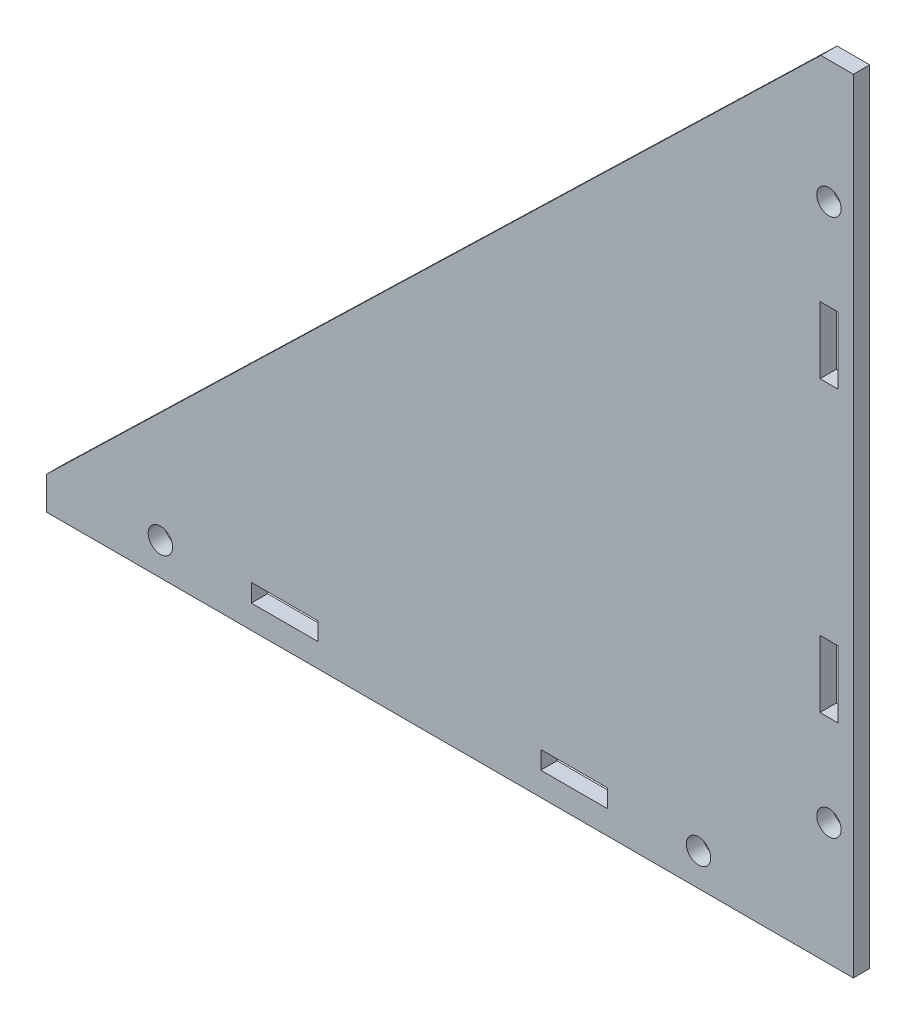
ISO-10303-21;
HEADER;
FILE_DESCRIPTION(('STEP AP214'),'2;1');
FILE_NAME('part.step','',(''),(''),'','','');
FILE_SCHEMA(('AUTOMOTIVE_DESIGN { 1 0 10303 214 1 1 1 1 }'));
ENDSEC;
DATA;
#1=APPLICATION_CONTEXT('core data for automotive mechanical design processes');
#2=APPLICATION_PROTOCOL_DEFINITION('international standard','automotive_design',2000,#1);
#3=PRODUCT_CONTEXT('',#1,'mechanical');
#4=PRODUCT('Part','Part','',(#3));
#5=PRODUCT_RELATED_PRODUCT_CATEGORY('part','',(#4));
#6=PRODUCT_DEFINITION_FORMATION('','',#4);
#7=PRODUCT_DEFINITION_CONTEXT('part definition',#1,'design');
#8=PRODUCT_DEFINITION('design','',#6,#7);
#9=PRODUCT_DEFINITION_SHAPE('','',#8);
#10=(LENGTH_UNIT() NAMED_UNIT(*) SI_UNIT(.MILLI.,.METRE.));
#11=(NAMED_UNIT(*) PLANE_ANGLE_UNIT() SI_UNIT($,.RADIAN.));
#12=(NAMED_UNIT(*) SI_UNIT($,.STERADIAN.) SOLID_ANGLE_UNIT());
#13=UNCERTAINTY_MEASURE_WITH_UNIT(LENGTH_MEASURE(1.E-05),#10,'distance_accuracy_value','');
#14=(GEOMETRIC_REPRESENTATION_CONTEXT(3) GLOBAL_UNCERTAINTY_ASSIGNED_CONTEXT((#13)) GLOBAL_UNIT_ASSIGNED_CONTEXT((#10,
#11,#12)) REPRESENTATION_CONTEXT('',''));
#15=CARTESIAN_POINT('',(0.,0.,0.));
#16=DIRECTION('',(0.,0.,1.));
#17=DIRECTION('',(1.,0.,0.));
#18=AXIS2_PLACEMENT_3D('',#15,#16,#17);
#19=CARTESIAN_POINT('',(0.,0.,2.));
#20=DIRECTION('',(0.,0.,1.));
#21=DIRECTION('',(1.,0.,0.));
#22=AXIS2_PLACEMENT_3D('',#19,#20,#21);
#23=PLANE('',#22);
#24=DIRECTION('',(0.,1.,0.));
#25=VECTOR('',#24,1.);
#26=CARTESIAN_POINT('',(47.8338443865942,-92.4245123954285,2.));
#27=LINE('',#26,#25);
#28=CARTESIAN_POINT('',(47.8338443865942,-92.4245123954285,2.));
#29=VERTEX_POINT('',#28);
#30=CARTESIAN_POINT('',(47.8338443865942,-84.2245123954286,2.));
#31=VERTEX_POINT('',#30);
#32=EDGE_CURVE('E220',#29,#31,#27,.T.);
#33=ORIENTED_EDGE('',*,*,#32,.F.);
#34=DIRECTION('',(1.,0.,0.));
#35=VECTOR('',#34,1.);
#36=CARTESIAN_POINT('',(45.6338443865943,-92.4245123954285,2.));
#37=LINE('',#36,#35);
#38=CARTESIAN_POINT('',(45.6338443865943,-92.4245123954285,2.));
#39=VERTEX_POINT('',#38);
#40=EDGE_CURVE('E218',#39,#29,#37,.T.);
#41=ORIENTED_EDGE('',*,*,#40,.F.);
#42=DIRECTION('',(0.,-1.,0.));
#43=VECTOR('',#42,1.);
#44=CARTESIAN_POINT('',(45.6338443865943,-92.4245123954285,2.));
#45=LINE('',#44,#43);
#46=CARTESIAN_POINT('',(45.6338443865943,-84.2245123954285,2.));
#47=VERTEX_POINT('',#46);
#48=EDGE_CURVE('E226',#47,#39,#45,.T.);
#49=ORIENTED_EDGE('',*,*,#48,.F.);
#50=DIRECTION('',(-1.,0.,0.));
#51=VECTOR('',#50,1.);
#52=CARTESIAN_POINT('',(45.6338443865943,-84.2245123954285,2.));
#53=LINE('',#52,#51);
#54=EDGE_CURVE('E223',#31,#47,#53,.T.);
#55=ORIENTED_EDGE('',*,*,#54,.F.);
#56=EDGE_LOOP('',(#33,#41,#49,#55));
#57=FACE_BOUND('',#56,.T.);
#58=DIRECTION('',(0.,-1.,0.));
#59=VECTOR('',#58,1.);
#60=CARTESIAN_POINT('',(11.3838443863399,-113.474512395683,2.));
#61=LINE('',#60,#59);
#62=CARTESIAN_POINT('',(11.3838443863399,-113.474512395683,2.));
#63=VERTEX_POINT('',#62);
#64=CARTESIAN_POINT('',(11.3838443863399,-115.674512395683,2.));
#65=VERTEX_POINT('',#64);
#66=EDGE_CURVE('E251',#63,#65,#61,.T.);
#67=ORIENTED_EDGE('',*,*,#66,.F.);
#68=DIRECTION('',(-1.,0.,0.));
#69=VECTOR('',#68,1.);
#70=CARTESIAN_POINT('',(19.5838443863399,-113.474512395683,2.));
#71=LINE('',#70,#69);
#72=CARTESIAN_POINT('',(19.5838443863399,-113.474512395683,2.));
#73=VERTEX_POINT('',#72);
#74=EDGE_CURVE('E249',#73,#63,#71,.T.);
#75=ORIENTED_EDGE('',*,*,#74,.F.);
#76=DIRECTION('',(0.,1.,0.));
#77=VECTOR('',#76,1.);
#78=CARTESIAN_POINT('',(19.5838443863399,-113.474512395683,2.));
#79=LINE('',#78,#77);
#80=CARTESIAN_POINT('',(19.5838443863399,-115.674512395683,2.));
#81=VERTEX_POINT('',#80);
#82=EDGE_CURVE('E257',#81,#73,#79,.T.);
#83=ORIENTED_EDGE('',*,*,#82,.F.);
#84=DIRECTION('',(1.,0.,0.));
#85=VECTOR('',#84,1.);
#86=CARTESIAN_POINT('',(19.5838443863399,-115.674512395683,2.));
#87=LINE('',#86,#85);
#88=EDGE_CURVE('E254',#65,#81,#87,.T.);
#89=ORIENTED_EDGE('',*,*,#88,.F.);
#90=EDGE_LOOP('',(#67,#75,#83,#89));
#91=FACE_BOUND('',#90,.T.);
#92=CARTESIAN_POINT('',(30.7338443863387,-114.574512395683,2.));
#93=DIRECTION('',(0.,0.,1.));
#94=DIRECTION('',(-1.,0.,0.));
#95=AXIS2_PLACEMENT_3D('',#92,#93,#94);
#96=CIRCLE('',#95,1.50000000007195);
#97=CARTESIAN_POINT('',(29.2338443862667,-114.574512395683,2.));
#98=VERTEX_POINT('',#97);
#99=EDGE_CURVE('E280',#98,#98,#96,.T.);
#100=ORIENTED_EDGE('',*,*,#99,.F.);
#101=EDGE_LOOP('',(#100));
#102=FACE_BOUND('',#101,.T.);
#103=DIRECTION('',(1.,0.,0.));
#104=VECTOR('',#103,1.);
#105=CARTESIAN_POINT('',(-24.116155613657,-115.674512395683,2.));
#106=LINE('',#105,#104);
#107=CARTESIAN_POINT('',(-24.116155613657,-115.674512395683,2.));
#108=VERTEX_POINT('',#107);
#109=CARTESIAN_POINT('',(-15.916155613657,-115.674512395683,2.));
#110=VERTEX_POINT('',#109);
#111=EDGE_CURVE('E294',#108,#110,#106,.T.);
#112=ORIENTED_EDGE('',*,*,#111,.F.);
#113=DIRECTION('',(0.,-1.,0.));
#114=VECTOR('',#113,1.);
#115=CARTESIAN_POINT('',(-24.116155613657,-113.474512395683,2.));
#116=LINE('',#115,#114);
#117=CARTESIAN_POINT('',(-24.116155613657,-113.474512395683,2.));
#118=VERTEX_POINT('',#117);
#119=EDGE_CURVE('E292',#118,#108,#116,.T.);
#120=ORIENTED_EDGE('',*,*,#119,.F.);
#121=DIRECTION('',(-1.,0.,0.));
#122=VECTOR('',#121,1.);
#123=CARTESIAN_POINT('',(-24.116155613657,-113.474512395683,2.));
#124=LINE('',#123,#122);
#125=CARTESIAN_POINT('',(-15.916155613657,-113.474512395683,2.));
#126=VERTEX_POINT('',#125);
#127=EDGE_CURVE('E300',#126,#118,#124,.T.);
#128=ORIENTED_EDGE('',*,*,#127,.F.);
#129=DIRECTION('',(0.,1.,0.));
#130=VECTOR('',#129,1.);
#131=CARTESIAN_POINT('',(-15.916155613657,-113.474512395683,2.));
#132=LINE('',#131,#130);
#133=EDGE_CURVE('E297',#110,#126,#132,.T.);
#134=ORIENTED_EDGE('',*,*,#133,.F.);
#135=EDGE_LOOP('',(#112,#120,#128,#134));
#136=FACE_BOUND('',#135,.T.);
#137=CARTESIAN_POINT('',(-35.2661556136557,-114.574512395683,2.));
#138=DIRECTION('',(0.,0.,1.));
#139=DIRECTION('',(1.,0.,0.));
#140=AXIS2_PLACEMENT_3D('',#137,#138,#139);
#141=CIRCLE('',#140,1.50000000007195);
#142=CARTESIAN_POINT('',(-33.7661556135838,-114.574512395683,2.));
#143=VERTEX_POINT('',#142);
#144=EDGE_CURVE('E323',#143,#143,#141,.T.);
#145=ORIENTED_EDGE('',*,*,#144,.F.);
#146=EDGE_LOOP('',(#145));
#147=FACE_BOUND('',#146,.T.);
#148=DIRECTION('',(1.,0.,0.));
#149=VECTOR('',#148,1.);
#150=CARTESIAN_POINT('',(48.7338443863415,-118.57451239543,2.));
#151=LINE('',#150,#149);
#152=CARTESIAN_POINT('',(-49.2661556136585,-118.57451239543,2.));
#153=VERTEX_POINT('',#152);
#154=CARTESIAN_POINT('',(49.7338443863415,-118.57451239543,2.));
#155=VERTEX_POINT('',#154);
#156=EDGE_CURVE('E329',#153,#155,#151,.T.);
#157=ORIENTED_EDGE('',*,*,#156,.T.);
#158=DIRECTION('',(0.,1.,0.));
#159=VECTOR('',#158,1.);
#160=CARTESIAN_POINT('',(49.7338443863415,-118.57451239543,2.));
#161=LINE('',#160,#159);
#162=CARTESIAN_POINT('',(49.7338443863415,-22.5745123954302,2.));
#163=VERTEX_POINT('',#162);
#164=EDGE_CURVE('E332',#155,#163,#161,.T.);
#165=ORIENTED_EDGE('',*,*,#164,.T.);
#166=DIRECTION('',(-1.,0.,0.));
#167=VECTOR('',#166,1.);
#168=CARTESIAN_POINT('',(49.7338443863415,-22.5745123954302,2.));
#169=LINE('',#168,#167);
#170=CARTESIAN_POINT('',(45.7338443863415,-22.5745123954302,2.));
#171=VERTEX_POINT('',#170);
#172=EDGE_CURVE('E335',#163,#171,#169,.T.);
#173=ORIENTED_EDGE('',*,*,#172,.T.);
#174=DIRECTION('',(-0.718358303958508,-0.695673304888046,0.));
#175=VECTOR('',#174,1.);
#176=CARTESIAN_POINT('',(45.7338443863415,-22.5745123954302,2.));
#177=LINE('',#176,#175);
#178=CARTESIAN_POINT('',(-49.2661556136585,-114.574512395683,2.));
#179=VERTEX_POINT('',#178);
#180=EDGE_CURVE('E337',#171,#179,#177,.T.);
#181=ORIENTED_EDGE('',*,*,#180,.T.);
#182=DIRECTION('',(0.,-1.,0.));
#183=VECTOR('',#182,1.);
#184=CARTESIAN_POINT('',(-49.2661556136585,-114.574512395683,2.));
#185=LINE('',#184,#183);
#186=EDGE_CURVE('E339',#179,#153,#185,.T.);
#187=ORIENTED_EDGE('',*,*,#186,.T.);
#188=EDGE_LOOP('',(#157,#165,#173,#181,#187));
#189=FACE_BOUND('',#188,.T.);
#190=CARTESIAN_POINT('',(46.7338443865942,-103.574512395427,2.));
#191=DIRECTION('',(0.,0.,1.));
#192=DIRECTION('',(1.,0.,0.));
#193=AXIS2_PLACEMENT_3D('',#190,#191,#192);
#194=CIRCLE('',#193,1.50000000007195);
#195=CARTESIAN_POINT('',(48.2338443866662,-103.574512395427,2.));
#196=VERTEX_POINT('',#195);
#197=EDGE_CURVE('E286',#196,#196,#194,.T.);
#198=ORIENTED_EDGE('',*,*,#197,.F.);
#199=EDGE_LOOP('',(#198));
#200=FACE_BOUND('',#199,.T.);
#201=CARTESIAN_POINT('',(46.7338443865921,-37.6161790621103,2.));
#202=DIRECTION('',(0.,0.,1.));
#203=DIRECTION('',(-1.,0.,0.));
#204=AXIS2_PLACEMENT_3D('',#201,#202,#203);
#205=CIRCLE('',#204,1.50000000007398);
#206=CARTESIAN_POINT('',(45.2338443865181,-37.6161790621103,2.));
#207=VERTEX_POINT('',#206);
#208=EDGE_CURVE('E212',#207,#207,#205,.T.);
#209=ORIENTED_EDGE('',*,*,#208,.F.);
#210=EDGE_LOOP('',(#209));
#211=FACE_BOUND('',#210,.T.);
#212=DIRECTION('',(1.,0.,0.));
#213=VECTOR('',#212,1.);
#214=CARTESIAN_POINT('',(45.6338443865923,-56.9661790621091,2.));
#215=LINE('',#214,#213);
#216=CARTESIAN_POINT('',(45.6338443865923,-56.9661790621091,2.));
#217=VERTEX_POINT('',#216);
#218=CARTESIAN_POINT('',(47.8338443865924,-56.966179062109,2.));
#219=VERTEX_POINT('',#218);
#220=EDGE_CURVE('E184',#217,#219,#215,.T.);
#221=ORIENTED_EDGE('',*,*,#220,.F.);
#222=DIRECTION('',(0.,-1.,0.));
#223=VECTOR('',#222,1.);
#224=CARTESIAN_POINT('',(45.6338443865918,-48.7661790621092,2.));
#225=LINE('',#224,#223);
#226=CARTESIAN_POINT('',(45.6338443865918,-48.7661790621092,2.));
#227=VERTEX_POINT('',#226);
#228=EDGE_CURVE('E176',#227,#217,#225,.T.);
#229=ORIENTED_EDGE('',*,*,#228,.F.);
#230=DIRECTION('',(-1.,0.,0.));
#231=VECTOR('',#230,1.);
#232=CARTESIAN_POINT('',(45.6338443865918,-48.7661790621092,2.));
#233=LINE('',#232,#231);
#234=CARTESIAN_POINT('',(47.8338443865924,-48.766179062109,2.));
#235=VERTEX_POINT('',#234);
#236=EDGE_CURVE('E198',#235,#227,#233,.T.);
#237=ORIENTED_EDGE('',*,*,#236,.F.);
#238=DIRECTION('',(0.,1.,0.));
#239=VECTOR('',#238,1.);
#240=CARTESIAN_POINT('',(47.8338443865924,-48.766179062109,2.));
#241=LINE('',#240,#239);
#242=EDGE_CURVE('E196',#219,#235,#241,.T.);
#243=ORIENTED_EDGE('',*,*,#242,.F.);
#244=EDGE_LOOP('',(#221,#229,#237,#243));
#245=FACE_BOUND('',#244,.T.);
#246=ADVANCED_FACE('F33',(#57,#91,#102,#136,#147,#189,#200,#211,#245),#23,.T.);
#247=CARTESIAN_POINT('',(0.,0.,0.));
#248=DIRECTION('',(0.,0.,1.));
#249=DIRECTION('',(1.,0.,0.));
#250=AXIS2_PLACEMENT_3D('',#247,#248,#249);
#251=PLANE('',#250);
#252=CARTESIAN_POINT('',(46.7338443865921,-37.6161790621103,0.));
#253=DIRECTION('',(0.,0.,1.));
#254=DIRECTION('',(-1.,0.,0.));
#255=AXIS2_PLACEMENT_3D('',#252,#253,#254);
#256=CIRCLE('',#255,1.50000000007398);
#257=CARTESIAN_POINT('',(45.2338443865181,-37.6161790621103,0.));
#258=VERTEX_POINT('',#257);
#259=EDGE_CURVE('E192',#258,#258,#256,.T.);
#260=ORIENTED_EDGE('',*,*,#259,.T.);
#261=EDGE_LOOP('',(#260));
#262=FACE_BOUND('',#261,.T.);
#263=DIRECTION('',(1.,0.,0.));
#264=VECTOR('',#263,1.);
#265=CARTESIAN_POINT('',(45.6338443865943,-92.4245123954285,0.));
#266=LINE('',#265,#264);
#267=CARTESIAN_POINT('',(45.6338443865943,-92.4245123954285,0.));
#268=VERTEX_POINT('',#267);
#269=CARTESIAN_POINT('',(47.8338443865942,-92.4245123954285,0.));
#270=VERTEX_POINT('',#269);
#271=EDGE_CURVE('E215',#268,#270,#266,.T.);
#272=ORIENTED_EDGE('',*,*,#271,.T.);
#273=DIRECTION('',(0.,1.,0.));
#274=VECTOR('',#273,1.);
#275=CARTESIAN_POINT('',(47.8338443865942,-92.4245123954285,0.));
#276=LINE('',#275,#274);
#277=CARTESIAN_POINT('',(47.8338443865942,-84.2245123954286,0.));
#278=VERTEX_POINT('',#277);
#279=EDGE_CURVE('E231',#270,#278,#276,.T.);
#280=ORIENTED_EDGE('',*,*,#279,.T.);
#281=DIRECTION('',(-1.,0.,0.));
#282=VECTOR('',#281,1.);
#283=CARTESIAN_POINT('',(45.6338443865943,-84.2245123954285,0.));
#284=LINE('',#283,#282);
#285=CARTESIAN_POINT('',(45.6338443865943,-84.2245123954285,0.));
#286=VERTEX_POINT('',#285);
#287=EDGE_CURVE('E234',#278,#286,#284,.T.);
#288=ORIENTED_EDGE('',*,*,#287,.T.);
#289=DIRECTION('',(0.,-1.,0.));
#290=VECTOR('',#289,1.);
#291=CARTESIAN_POINT('',(45.6338443865943,-92.4245123954285,0.));
#292=LINE('',#291,#290);
#293=EDGE_CURVE('E221',#286,#268,#292,.T.);
#294=ORIENTED_EDGE('',*,*,#293,.T.);
#295=EDGE_LOOP('',(#272,#280,#288,#294));
#296=FACE_BOUND('',#295,.T.);
#297=CARTESIAN_POINT('',(30.7338443863387,-114.574512395683,0.));
#298=DIRECTION('',(0.,0.,1.));
#299=DIRECTION('',(-1.,0.,0.));
#300=AXIS2_PLACEMENT_3D('',#297,#298,#299);
#301=CIRCLE('',#300,1.50000000007195);
#302=CARTESIAN_POINT('',(29.2338443862667,-114.574512395683,0.));
#303=VERTEX_POINT('',#302);
#304=EDGE_CURVE('E279',#303,#303,#301,.T.);
#305=ORIENTED_EDGE('',*,*,#304,.T.);
#306=EDGE_LOOP('',(#305));
#307=FACE_BOUND('',#306,.T.);
#308=CARTESIAN_POINT('',(46.7338443865942,-103.574512395427,0.));
#309=DIRECTION('',(0.,0.,1.));
#310=DIRECTION('',(1.,0.,0.));
#311=AXIS2_PLACEMENT_3D('',#308,#309,#310);
#312=CIRCLE('',#311,1.50000000007195);
#313=CARTESIAN_POINT('',(48.2338443866662,-103.574512395427,0.));
#314=VERTEX_POINT('',#313);
#315=EDGE_CURVE('E283',#314,#314,#312,.T.);
#316=ORIENTED_EDGE('',*,*,#315,.T.);
#317=EDGE_LOOP('',(#316));
#318=FACE_BOUND('',#317,.T.);
#319=DIRECTION('',(0.,-1.,0.));
#320=VECTOR('',#319,1.);
#321=CARTESIAN_POINT('',(-24.116155613657,-113.474512395683,0.));
#322=LINE('',#321,#320);
#323=CARTESIAN_POINT('',(-24.116155613657,-113.474512395683,0.));
#324=VERTEX_POINT('',#323);
#325=CARTESIAN_POINT('',(-24.116155613657,-115.674512395683,0.));
#326=VERTEX_POINT('',#325);
#327=EDGE_CURVE('E289',#324,#326,#322,.T.);
#328=ORIENTED_EDGE('',*,*,#327,.T.);
#329=DIRECTION('',(1.,0.,0.));
#330=VECTOR('',#329,1.);
#331=CARTESIAN_POINT('',(-24.116155613657,-115.674512395683,0.));
#332=LINE('',#331,#330);
#333=CARTESIAN_POINT('',(-15.916155613657,-115.674512395683,0.));
#334=VERTEX_POINT('',#333);
#335=EDGE_CURVE('E305',#326,#334,#332,.T.);
#336=ORIENTED_EDGE('',*,*,#335,.T.);
#337=DIRECTION('',(0.,1.,0.));
#338=VECTOR('',#337,1.);
#339=CARTESIAN_POINT('',(-15.916155613657,-113.474512395683,0.));
#340=LINE('',#339,#338);
#341=CARTESIAN_POINT('',(-15.916155613657,-113.474512395683,0.));
#342=VERTEX_POINT('',#341);
#343=EDGE_CURVE('E308',#334,#342,#340,.T.);
#344=ORIENTED_EDGE('',*,*,#343,.T.);
#345=DIRECTION('',(-1.,0.,0.));
#346=VECTOR('',#345,1.);
#347=CARTESIAN_POINT('',(-24.116155613657,-113.474512395683,0.));
#348=LINE('',#347,#346);
#349=EDGE_CURVE('E295',#342,#324,#348,.T.);
#350=ORIENTED_EDGE('',*,*,#349,.T.);
#351=EDGE_LOOP('',(#328,#336,#344,#350));
#352=FACE_BOUND('',#351,.T.);
#353=DIRECTION('',(0.,1.,0.));
#354=VECTOR('',#353,1.);
#355=CARTESIAN_POINT('',(49.7338443863415,-118.57451239543,0.));
#356=LINE('',#355,#354);
#357=CARTESIAN_POINT('',(49.7338443863415,-118.57451239543,0.));
#358=VERTEX_POINT('',#357);
#359=CARTESIAN_POINT('',(49.7338443863415,-22.5745123954302,0.));
#360=VERTEX_POINT('',#359);
#361=EDGE_CURVE('E326',#358,#360,#356,.T.);
#362=ORIENTED_EDGE('',*,*,#361,.F.);
#363=DIRECTION('',(1.,0.,0.));
#364=VECTOR('',#363,1.);
#365=CARTESIAN_POINT('',(44.7338443863415,-118.57451239543,0.));
#366=LINE('',#365,#364);
#367=CARTESIAN_POINT('',(-49.2661556136585,-118.57451239543,0.));
#368=VERTEX_POINT('',#367);
#369=EDGE_CURVE('E333',#368,#358,#366,.T.);
#370=ORIENTED_EDGE('',*,*,#369,.F.);
#371=DIRECTION('',(0.,-1.,0.));
#372=VECTOR('',#371,1.);
#373=CARTESIAN_POINT('',(-49.2661556136585,-114.574512395683,0.));
#374=LINE('',#373,#372);
#375=CARTESIAN_POINT('',(-49.2661556136585,-114.574512395683,0.));
#376=VERTEX_POINT('',#375);
#377=EDGE_CURVE('E348',#376,#368,#374,.T.);
#378=ORIENTED_EDGE('',*,*,#377,.F.);
#379=DIRECTION('',(-0.718358303958508,-0.695673304888046,0.));
#380=VECTOR('',#379,1.);
#381=CARTESIAN_POINT('',(45.7338443863415,-22.5745123954302,0.));
#382=LINE('',#381,#380);
#383=CARTESIAN_POINT('',(45.7338443863415,-22.5745123954302,0.));
#384=VERTEX_POINT('',#383);
#385=EDGE_CURVE('E346',#384,#376,#382,.T.);
#386=ORIENTED_EDGE('',*,*,#385,.F.);
#387=DIRECTION('',(-1.,0.,0.));
#388=VECTOR('',#387,1.);
#389=CARTESIAN_POINT('',(49.7338443863415,-22.5745123954302,0.));
#390=LINE('',#389,#388);
#391=EDGE_CURVE('E344',#360,#384,#390,.T.);
#392=ORIENTED_EDGE('',*,*,#391,.F.);
#393=EDGE_LOOP('',(#362,#370,#378,#386,#392));
#394=FACE_BOUND('',#393,.T.);
#395=CARTESIAN_POINT('',(-35.2661556136557,-114.574512395683,0.));
#396=DIRECTION('',(0.,0.,1.));
#397=DIRECTION('',(1.,0.,0.));
#398=AXIS2_PLACEMENT_3D('',#395,#396,#397);
#399=CIRCLE('',#398,1.50000000007195);
#400=CARTESIAN_POINT('',(-33.7661556135838,-114.574512395683,0.));
#401=VERTEX_POINT('',#400);
#402=EDGE_CURVE('E322',#401,#401,#399,.T.);
#403=ORIENTED_EDGE('',*,*,#402,.T.);
#404=EDGE_LOOP('',(#403));
#405=FACE_BOUND('',#404,.T.);
#406=DIRECTION('',(-1.,0.,0.));
#407=VECTOR('',#406,1.);
#408=CARTESIAN_POINT('',(19.5838443863399,-113.474512395683,0.));
#409=LINE('',#408,#407);
#410=CARTESIAN_POINT('',(19.5838443863399,-113.474512395683,0.));
#411=VERTEX_POINT('',#410);
#412=CARTESIAN_POINT('',(11.3838443863399,-113.474512395683,0.));
#413=VERTEX_POINT('',#412);
#414=EDGE_CURVE('E248',#411,#413,#409,.T.);
#415=ORIENTED_EDGE('',*,*,#414,.T.);
#416=DIRECTION('',(0.,-1.,0.));
#417=VECTOR('',#416,1.);
#418=CARTESIAN_POINT('',(11.3838443863399,-113.474512395683,0.));
#419=LINE('',#418,#417);
#420=CARTESIAN_POINT('',(11.3838443863399,-115.674512395683,0.));
#421=VERTEX_POINT('',#420);
#422=EDGE_CURVE('E262',#413,#421,#419,.T.);
#423=ORIENTED_EDGE('',*,*,#422,.T.);
#424=DIRECTION('',(1.,0.,0.));
#425=VECTOR('',#424,1.);
#426=CARTESIAN_POINT('',(19.5838443863399,-115.674512395683,0.));
#427=LINE('',#426,#425);
#428=CARTESIAN_POINT('',(19.5838443863399,-115.674512395683,0.));
#429=VERTEX_POINT('',#428);
#430=EDGE_CURVE('E265',#421,#429,#427,.T.);
#431=ORIENTED_EDGE('',*,*,#430,.T.);
#432=DIRECTION('',(0.,1.,0.));
#433=VECTOR('',#432,1.);
#434=CARTESIAN_POINT('',(19.5838443863399,-113.474512395683,0.));
#435=LINE('',#434,#433);
#436=EDGE_CURVE('E252',#429,#411,#435,.T.);
#437=ORIENTED_EDGE('',*,*,#436,.T.);
#438=EDGE_LOOP('',(#415,#423,#431,#437));
#439=FACE_BOUND('',#438,.T.);
#440=DIRECTION('',(0.,-1.,0.));
#441=VECTOR('',#440,1.);
#442=CARTESIAN_POINT('',(45.6338443865918,-48.7661790621092,0.));
#443=LINE('',#442,#441);
#444=CARTESIAN_POINT('',(45.6338443865918,-48.7661790621092,0.));
#445=VERTEX_POINT('',#444);
#446=CARTESIAN_POINT('',(45.6338443865923,-56.9661790621091,0.));
#447=VERTEX_POINT('',#446);
#448=EDGE_CURVE('E56',#445,#447,#443,.T.);
#449=ORIENTED_EDGE('',*,*,#448,.T.);
#450=DIRECTION('',(1.,0.,0.));
#451=VECTOR('',#450,1.);
#452=CARTESIAN_POINT('',(45.6338443865923,-56.9661790621091,0.));
#453=LINE('',#452,#451);
#454=CARTESIAN_POINT('',(47.8338443865924,-56.966179062109,0.));
#455=VERTEX_POINT('',#454);
#456=EDGE_CURVE('E191',#447,#455,#453,.T.);
#457=ORIENTED_EDGE('',*,*,#456,.T.);
#458=DIRECTION('',(0.,1.,0.));
#459=VECTOR('',#458,1.);
#460=CARTESIAN_POINT('',(47.8338443865924,-48.766179062109,0.));
#461=LINE('',#460,#459);
#462=CARTESIAN_POINT('',(47.8338443865924,-48.766179062109,0.));
#463=VERTEX_POINT('',#462);
#464=EDGE_CURVE('E204',#455,#463,#461,.T.);
#465=ORIENTED_EDGE('',*,*,#464,.T.);
#466=DIRECTION('',(-1.,0.,0.));
#467=VECTOR('',#466,1.);
#468=CARTESIAN_POINT('',(45.6338443865918,-48.7661790621092,0.));
#469=LINE('',#468,#467);
#470=EDGE_CURVE('E185',#463,#445,#469,.T.);
#471=ORIENTED_EDGE('',*,*,#470,.T.);
#472=EDGE_LOOP('',(#449,#457,#465,#471));
#473=FACE_BOUND('',#472,.T.);
#474=ADVANCED_FACE('F370',(#262,#296,#307,#318,#352,#394,#405,#439,#473),#251,.F.);
#475=CARTESIAN_POINT('',(49.7338443863415,-118.57451239543,2.));
#476=DIRECTION('',(-1.,0.,0.));
#477=DIRECTION('',(0.,0.,1.));
#478=AXIS2_PLACEMENT_3D('',#475,#476,#477);
#479=PLANE('',#478);
#480=ORIENTED_EDGE('',*,*,#361,.T.);
#481=DIRECTION('',(0.,0.,-1.));
#482=VECTOR('',#481,1.);
#483=CARTESIAN_POINT('',(49.7338443863415,-22.5745123954302,2.));
#484=LINE('',#483,#482);
#485=EDGE_CURVE('E41',#163,#360,#484,.T.);
#486=ORIENTED_EDGE('',*,*,#485,.F.);
#487=ORIENTED_EDGE('',*,*,#164,.F.);
#488=DIRECTION('',(0.,0.,-1.));
#489=VECTOR('',#488,1.);
#490=CARTESIAN_POINT('',(49.7338443863415,-118.57451239543,2.));
#491=LINE('',#490,#489);
#492=EDGE_CURVE('E11',#155,#358,#491,.T.);
#493=ORIENTED_EDGE('',*,*,#492,.T.);
#494=EDGE_LOOP('',(#480,#486,#487,#493));
#495=FACE_BOUND('',#494,.T.);
#496=ADVANCED_FACE('F35',(#495),#479,.F.);
#497=CARTESIAN_POINT('',(49.7338443863415,-22.5745123954302,2.));
#498=DIRECTION('',(0.,-1.,0.));
#499=DIRECTION('',(0.,0.,-1.));
#500=AXIS2_PLACEMENT_3D('',#497,#498,#499);
#501=PLANE('',#500);
#502=ORIENTED_EDGE('',*,*,#391,.T.);
#503=DIRECTION('',(0.,0.,-1.));
#504=VECTOR('',#503,1.);
#505=CARTESIAN_POINT('',(45.7338443863415,-22.5745123954302,2.));
#506=LINE('',#505,#504);
#507=EDGE_CURVE('E357',#171,#384,#506,.T.);
#508=ORIENTED_EDGE('',*,*,#507,.F.);
#509=ORIENTED_EDGE('',*,*,#172,.F.);
#510=ORIENTED_EDGE('',*,*,#485,.T.);
#511=EDGE_LOOP('',(#502,#508,#509,#510));
#512=FACE_BOUND('',#511,.T.);
#513=ADVANCED_FACE('F364',(#512),#501,.F.);
#514=CARTESIAN_POINT('',(45.7338443863415,-22.5745123954302,2.));
#515=DIRECTION('',(0.695673304888046,-0.718358303958508,0.));
#516=DIRECTION('',(0.718358303958508,0.695673304888046,0.));
#517=AXIS2_PLACEMENT_3D('',#514,#515,#516);
#518=PLANE('',#517);
#519=ORIENTED_EDGE('',*,*,#385,.T.);
#520=DIRECTION('',(0.,0.,-1.));
#521=VECTOR('',#520,1.);
#522=CARTESIAN_POINT('',(-49.2661556136585,-114.574512395683,2.));
#523=LINE('',#522,#521);
#524=EDGE_CURVE('E354',#179,#376,#523,.T.);
#525=ORIENTED_EDGE('',*,*,#524,.F.);
#526=ORIENTED_EDGE('',*,*,#180,.F.);
#527=ORIENTED_EDGE('',*,*,#507,.T.);
#528=EDGE_LOOP('',(#519,#525,#526,#527));
#529=FACE_BOUND('',#528,.T.);
#530=ADVANCED_FACE('F375',(#529),#518,.F.);
#531=CARTESIAN_POINT('',(-49.2661556136585,-114.574512395683,2.));
#532=DIRECTION('',(1.,0.,0.));
#533=DIRECTION('',(0.,0.,-1.));
#534=AXIS2_PLACEMENT_3D('',#531,#532,#533);
#535=PLANE('',#534);
#536=ORIENTED_EDGE('',*,*,#377,.T.);
#537=DIRECTION('',(0.,0.,-1.));
#538=VECTOR('',#537,1.);
#539=CARTESIAN_POINT('',(-49.2661556136585,-118.57451239543,2.));
#540=LINE('',#539,#538);
#541=EDGE_CURVE('E342',#153,#368,#540,.T.);
#542=ORIENTED_EDGE('',*,*,#541,.F.);
#543=ORIENTED_EDGE('',*,*,#186,.F.);
#544=ORIENTED_EDGE('',*,*,#524,.T.);
#545=EDGE_LOOP('',(#536,#542,#543,#544));
#546=FACE_BOUND('',#545,.T.);
#547=ADVANCED_FACE('F379',(#546),#535,.F.);
#548=CARTESIAN_POINT('',(44.7338443863415,-118.57451239543,2.));
#549=DIRECTION('',(0.,1.,0.));
#550=DIRECTION('',(0.,0.,1.));
#551=AXIS2_PLACEMENT_3D('',#548,#549,#550);
#552=PLANE('',#551);
#553=ORIENTED_EDGE('',*,*,#369,.T.);
#554=ORIENTED_EDGE('',*,*,#492,.F.);
#555=ORIENTED_EDGE('',*,*,#156,.F.);
#556=ORIENTED_EDGE('',*,*,#541,.T.);
#557=EDGE_LOOP('',(#553,#554,#555,#556));
#558=FACE_BOUND('',#557,.T.);
#559=ADVANCED_FACE('F385',(#558),#552,.F.);
#560=CARTESIAN_POINT('',(-35.2661556136557,-114.574512395683,2.));
#561=DIRECTION('',(0.,0.,-1.));
#562=DIRECTION('',(-1.,0.,0.));
#563=AXIS2_PLACEMENT_3D('',#560,#561,#562);
#564=CYLINDRICAL_SURFACE('',#563,1.50000000007195);
#565=ORIENTED_EDGE('',*,*,#144,.T.);
#566=EDGE_LOOP('',(#565));
#567=FACE_BOUND('',#566,.T.);
#568=ORIENTED_EDGE('',*,*,#402,.F.);
#569=EDGE_LOOP('',(#568));
#570=FACE_BOUND('',#569,.T.);
#571=ADVANCED_FACE('F387',(#567,#570),#564,.F.);
#572=CARTESIAN_POINT('',(-24.116155613657,-113.474512395683,2.));
#573=DIRECTION('',(1.,0.,0.));
#574=DIRECTION('',(0.,0.,-1.));
#575=AXIS2_PLACEMENT_3D('',#572,#573,#574);
#576=PLANE('',#575);
#577=ORIENTED_EDGE('',*,*,#327,.F.);
#578=DIRECTION('',(0.,0.,-1.));
#579=VECTOR('',#578,1.);
#580=CARTESIAN_POINT('',(-24.116155613657,-113.474512395683,2.));
#581=LINE('',#580,#579);
#582=EDGE_CURVE('E302',#118,#324,#581,.T.);
#583=ORIENTED_EDGE('',*,*,#582,.F.);
#584=ORIENTED_EDGE('',*,*,#119,.T.);
#585=DIRECTION('',(0.,0.,-1.));
#586=VECTOR('',#585,1.);
#587=CARTESIAN_POINT('',(-24.116155613657,-115.674512395683,2.));
#588=LINE('',#587,#586);
#589=EDGE_CURVE('E319',#108,#326,#588,.T.);
#590=ORIENTED_EDGE('',*,*,#589,.T.);
#591=EDGE_LOOP('',(#577,#583,#584,#590));
#592=FACE_BOUND('',#591,.T.);
#593=ADVANCED_FACE('F393',(#592),#576,.T.);
#594=CARTESIAN_POINT('',(-24.116155613657,-115.674512395683,2.));
#595=DIRECTION('',(0.,1.,0.));
#596=DIRECTION('',(0.,0.,1.));
#597=AXIS2_PLACEMENT_3D('',#594,#595,#596);
#598=PLANE('',#597);
#599=ORIENTED_EDGE('',*,*,#335,.F.);
#600=ORIENTED_EDGE('',*,*,#589,.F.);
#601=ORIENTED_EDGE('',*,*,#111,.T.);
#602=DIRECTION('',(0.,0.,-1.));
#603=VECTOR('',#602,1.);
#604=CARTESIAN_POINT('',(-15.916155613657,-115.674512395683,2.));
#605=LINE('',#604,#603);
#606=EDGE_CURVE('E317',#110,#334,#605,.T.);
#607=ORIENTED_EDGE('',*,*,#606,.T.);
#608=EDGE_LOOP('',(#599,#600,#601,#607));
#609=FACE_BOUND('',#608,.T.);
#610=ADVANCED_FACE('F410',(#609),#598,.T.);
#611=CARTESIAN_POINT('',(-15.916155613657,-113.474512395683,2.));
#612=DIRECTION('',(-1.,0.,0.));
#613=DIRECTION('',(0.,0.,1.));
#614=AXIS2_PLACEMENT_3D('',#611,#612,#613);
#615=PLANE('',#614);
#616=ORIENTED_EDGE('',*,*,#343,.F.);
#617=ORIENTED_EDGE('',*,*,#606,.F.);
#618=ORIENTED_EDGE('',*,*,#133,.T.);
#619=DIRECTION('',(0.,0.,-1.));
#620=VECTOR('',#619,1.);
#621=CARTESIAN_POINT('',(-15.916155613657,-113.474512395683,2.));
#622=LINE('',#621,#620);
#623=EDGE_CURVE('E315',#126,#342,#622,.T.);
#624=ORIENTED_EDGE('',*,*,#623,.T.);
#625=EDGE_LOOP('',(#616,#617,#618,#624));
#626=FACE_BOUND('',#625,.T.);
#627=ADVANCED_FACE('F414',(#626),#615,.T.);
#628=CARTESIAN_POINT('',(-24.116155613657,-113.474512395683,2.));
#629=DIRECTION('',(0.,-1.,0.));
#630=DIRECTION('',(0.,0.,-1.));
#631=AXIS2_PLACEMENT_3D('',#628,#629,#630);
#632=PLANE('',#631);
#633=ORIENTED_EDGE('',*,*,#349,.F.);
#634=ORIENTED_EDGE('',*,*,#623,.F.);
#635=ORIENTED_EDGE('',*,*,#127,.T.);
#636=ORIENTED_EDGE('',*,*,#582,.T.);
#637=EDGE_LOOP('',(#633,#634,#635,#636));
#638=FACE_BOUND('',#637,.T.);
#639=ADVANCED_FACE('F418',(#638),#632,.T.);
#640=CARTESIAN_POINT('',(46.7338443865942,-103.574512395427,2.));
#641=DIRECTION('',(0.,0.,-1.));
#642=DIRECTION('',(-1.,0.,0.));
#643=AXIS2_PLACEMENT_3D('',#640,#641,#642);
#644=CYLINDRICAL_SURFACE('',#643,1.50000000007195);
#645=ORIENTED_EDGE('',*,*,#197,.T.);
#646=EDGE_LOOP('',(#645));
#647=FACE_BOUND('',#646,.T.);
#648=ORIENTED_EDGE('',*,*,#315,.F.);
#649=EDGE_LOOP('',(#648));
#650=FACE_BOUND('',#649,.T.);
#651=ADVANCED_FACE('F422',(#647,#650),#644,.F.);
#652=CARTESIAN_POINT('',(30.7338443863387,-114.574512395683,2.));
#653=DIRECTION('',(0.,0.,-1.));
#654=DIRECTION('',(-1.,0.,0.));
#655=AXIS2_PLACEMENT_3D('',#652,#653,#654);
#656=CYLINDRICAL_SURFACE('',#655,1.50000000007195);
#657=ORIENTED_EDGE('',*,*,#99,.T.);
#658=EDGE_LOOP('',(#657));
#659=FACE_BOUND('',#658,.T.);
#660=ORIENTED_EDGE('',*,*,#304,.F.);
#661=EDGE_LOOP('',(#660));
#662=FACE_BOUND('',#661,.T.);
#663=ADVANCED_FACE('F426',(#659,#662),#656,.F.);
#664=CARTESIAN_POINT('',(19.5838443863399,-113.474512395683,2.));
#665=DIRECTION('',(0.,-1.,0.));
#666=DIRECTION('',(0.,0.,-1.));
#667=AXIS2_PLACEMENT_3D('',#664,#665,#666);
#668=PLANE('',#667);
#669=ORIENTED_EDGE('',*,*,#414,.F.);
#670=DIRECTION('',(0.,0.,-1.));
#671=VECTOR('',#670,1.);
#672=CARTESIAN_POINT('',(19.5838443863399,-113.474512395683,2.));
#673=LINE('',#672,#671);
#674=EDGE_CURVE('E259',#73,#411,#673,.T.);
#675=ORIENTED_EDGE('',*,*,#674,.F.);
#676=ORIENTED_EDGE('',*,*,#74,.T.);
#677=DIRECTION('',(0.,0.,-1.));
#678=VECTOR('',#677,1.);
#679=CARTESIAN_POINT('',(11.3838443863399,-113.474512395683,2.));
#680=LINE('',#679,#678);
#681=EDGE_CURVE('E276',#63,#413,#680,.T.);
#682=ORIENTED_EDGE('',*,*,#681,.T.);
#683=EDGE_LOOP('',(#669,#675,#676,#682));
#684=FACE_BOUND('',#683,.T.);
#685=ADVANCED_FACE('F430',(#684),#668,.T.);
#686=CARTESIAN_POINT('',(11.3838443863399,-113.474512395683,2.));
#687=DIRECTION('',(1.,0.,0.));
#688=DIRECTION('',(0.,0.,-1.));
#689=AXIS2_PLACEMENT_3D('',#686,#687,#688);
#690=PLANE('',#689);
#691=ORIENTED_EDGE('',*,*,#422,.F.);
#692=ORIENTED_EDGE('',*,*,#681,.F.);
#693=ORIENTED_EDGE('',*,*,#66,.T.);
#694=DIRECTION('',(0.,0.,-1.));
#695=VECTOR('',#694,1.);
#696=CARTESIAN_POINT('',(11.3838443863399,-115.674512395683,2.));
#697=LINE('',#696,#695);
#698=EDGE_CURVE('E274',#65,#421,#697,.T.);
#699=ORIENTED_EDGE('',*,*,#698,.T.);
#700=EDGE_LOOP('',(#691,#692,#693,#699));
#701=FACE_BOUND('',#700,.T.);
#702=ADVANCED_FACE('F434',(#701),#690,.T.);
#703=CARTESIAN_POINT('',(19.5838443863399,-115.674512395683,2.));
#704=DIRECTION('',(0.,1.,0.));
#705=DIRECTION('',(-1.,0.,0.));
#706=AXIS2_PLACEMENT_3D('',#703,#704,#705);
#707=PLANE('',#706);
#708=ORIENTED_EDGE('',*,*,#430,.F.);
#709=ORIENTED_EDGE('',*,*,#698,.F.);
#710=ORIENTED_EDGE('',*,*,#88,.T.);
#711=DIRECTION('',(0.,0.,-1.));
#712=VECTOR('',#711,1.);
#713=CARTESIAN_POINT('',(19.5838443863399,-115.674512395683,2.));
#714=LINE('',#713,#712);
#715=EDGE_CURVE('E272',#81,#429,#714,.T.);
#716=ORIENTED_EDGE('',*,*,#715,.T.);
#717=EDGE_LOOP('',(#708,#709,#710,#716));
#718=FACE_BOUND('',#717,.T.);
#719=ADVANCED_FACE('F438',(#718),#707,.T.);
#720=CARTESIAN_POINT('',(19.5838443863399,-113.474512395683,2.));
#721=DIRECTION('',(-1.,0.,0.));
#722=DIRECTION('',(0.,0.,1.));
#723=AXIS2_PLACEMENT_3D('',#720,#721,#722);
#724=PLANE('',#723);
#725=ORIENTED_EDGE('',*,*,#436,.F.);
#726=ORIENTED_EDGE('',*,*,#715,.F.);
#727=ORIENTED_EDGE('',*,*,#82,.T.);
#728=ORIENTED_EDGE('',*,*,#674,.T.);
#729=EDGE_LOOP('',(#725,#726,#727,#728));
#730=FACE_BOUND('',#729,.T.);
#731=ADVANCED_FACE('F442',(#730),#724,.T.);
#732=CARTESIAN_POINT('',(45.6338443865943,-92.4245123954285,2.));
#733=DIRECTION('',(0.,1.,0.));
#734=DIRECTION('',(-1.,0.,0.));
#735=AXIS2_PLACEMENT_3D('',#732,#733,#734);
#736=PLANE('',#735);
#737=ORIENTED_EDGE('',*,*,#271,.F.);
#738=DIRECTION('',(0.,0.,-1.));
#739=VECTOR('',#738,1.);
#740=CARTESIAN_POINT('',(45.6338443865943,-92.4245123954285,2.));
#741=LINE('',#740,#739);
#742=EDGE_CURVE('E228',#39,#268,#741,.T.);
#743=ORIENTED_EDGE('',*,*,#742,.F.);
#744=ORIENTED_EDGE('',*,*,#40,.T.);
#745=DIRECTION('',(0.,0.,-1.));
#746=VECTOR('',#745,1.);
#747=CARTESIAN_POINT('',(47.8338443865942,-92.4245123954285,2.));
#748=LINE('',#747,#746);
#749=EDGE_CURVE('E245',#29,#270,#748,.T.);
#750=ORIENTED_EDGE('',*,*,#749,.T.);
#751=EDGE_LOOP('',(#737,#743,#744,#750));
#752=FACE_BOUND('',#751,.T.);
#753=ADVANCED_FACE('F446',(#752),#736,.T.);
#754=CARTESIAN_POINT('',(47.8338443865942,-92.4245123954285,2.));
#755=DIRECTION('',(-1.,0.,0.));
#756=DIRECTION('',(0.,-1.,0.));
#757=AXIS2_PLACEMENT_3D('',#754,#755,#756);
#758=PLANE('',#757);
#759=ORIENTED_EDGE('',*,*,#279,.F.);
#760=ORIENTED_EDGE('',*,*,#749,.F.);
#761=ORIENTED_EDGE('',*,*,#32,.T.);
#762=DIRECTION('',(0.,0.,-1.));
#763=VECTOR('',#762,1.);
#764=CARTESIAN_POINT('',(47.8338443865942,-84.2245123954286,2.));
#765=LINE('',#764,#763);
#766=EDGE_CURVE('E243',#31,#278,#765,.T.);
#767=ORIENTED_EDGE('',*,*,#766,.T.);
#768=EDGE_LOOP('',(#759,#760,#761,#767));
#769=FACE_BOUND('',#768,.T.);
#770=ADVANCED_FACE('F450',(#769),#758,.T.);
#771=CARTESIAN_POINT('',(45.6338443865943,-84.2245123954285,2.));
#772=DIRECTION('',(0.,-1.,0.));
#773=DIRECTION('',(1.,0.,0.));
#774=AXIS2_PLACEMENT_3D('',#771,#772,#773);
#775=PLANE('',#774);
#776=ORIENTED_EDGE('',*,*,#287,.F.);
#777=ORIENTED_EDGE('',*,*,#766,.F.);
#778=ORIENTED_EDGE('',*,*,#54,.T.);
#779=DIRECTION('',(0.,0.,-1.));
#780=VECTOR('',#779,1.);
#781=CARTESIAN_POINT('',(45.6338443865943,-84.2245123954285,2.));
#782=LINE('',#781,#780);
#783=EDGE_CURVE('E241',#47,#286,#782,.T.);
#784=ORIENTED_EDGE('',*,*,#783,.T.);
#785=EDGE_LOOP('',(#776,#777,#778,#784));
#786=FACE_BOUND('',#785,.T.);
#787=ADVANCED_FACE('F454',(#786),#775,.T.);
#788=CARTESIAN_POINT('',(45.6338443865943,-92.4245123954285,2.));
#789=DIRECTION('',(1.,0.,0.));
#790=DIRECTION('',(0.,1.,0.));
#791=AXIS2_PLACEMENT_3D('',#788,#789,#790);
#792=PLANE('',#791);
#793=ORIENTED_EDGE('',*,*,#293,.F.);
#794=ORIENTED_EDGE('',*,*,#783,.F.);
#795=ORIENTED_EDGE('',*,*,#48,.T.);
#796=ORIENTED_EDGE('',*,*,#742,.T.);
#797=EDGE_LOOP('',(#793,#794,#795,#796));
#798=FACE_BOUND('',#797,.T.);
#799=ADVANCED_FACE('F458',(#798),#792,.T.);
#800=CARTESIAN_POINT('',(46.7338443865921,-37.6161790621103,2.));
#801=DIRECTION('',(0.,0.,-1.));
#802=DIRECTION('',(-1.,0.,0.));
#803=AXIS2_PLACEMENT_3D('',#800,#801,#802);
#804=CYLINDRICAL_SURFACE('',#803,1.50000000007398);
#805=ORIENTED_EDGE('',*,*,#208,.T.);
#806=EDGE_LOOP('',(#805));
#807=FACE_BOUND('',#806,.T.);
#808=ORIENTED_EDGE('',*,*,#259,.F.);
#809=EDGE_LOOP('',(#808));
#810=FACE_BOUND('',#809,.T.);
#811=ADVANCED_FACE('F462',(#807,#810),#804,.F.);
#812=CARTESIAN_POINT('',(45.6338443865918,-48.7661790621092,2.));
#813=DIRECTION('',(1.,0.,0.));
#814=DIRECTION('',(0.,1.,0.));
#815=AXIS2_PLACEMENT_3D('',#812,#813,#814);
#816=PLANE('',#815);
#817=ORIENTED_EDGE('',*,*,#448,.F.);
#818=DIRECTION('',(0.,0.,-1.));
#819=VECTOR('',#818,1.);
#820=CARTESIAN_POINT('',(45.6338443865918,-48.7661790621092,2.));
#821=LINE('',#820,#819);
#822=EDGE_CURVE('E180',#227,#445,#821,.T.);
#823=ORIENTED_EDGE('',*,*,#822,.F.);
#824=ORIENTED_EDGE('',*,*,#228,.T.);
#825=DIRECTION('',(0.,0.,-1.));
#826=VECTOR('',#825,1.);
#827=CARTESIAN_POINT('',(45.6338443865923,-56.9661790621091,2.));
#828=LINE('',#827,#826);
#829=EDGE_CURVE('E179',#217,#447,#828,.T.);
#830=ORIENTED_EDGE('',*,*,#829,.T.);
#831=EDGE_LOOP('',(#817,#823,#824,#830));
#832=FACE_BOUND('',#831,.T.);
#833=ADVANCED_FACE('F178',(#832),#816,.T.);
#834=CARTESIAN_POINT('',(45.6338443865923,-56.9661790621091,2.));
#835=DIRECTION('',(0.,1.,0.));
#836=DIRECTION('',(-1.,0.,0.));
#837=AXIS2_PLACEMENT_3D('',#834,#835,#836);
#838=PLANE('',#837);
#839=ORIENTED_EDGE('',*,*,#456,.F.);
#840=ORIENTED_EDGE('',*,*,#829,.F.);
#841=ORIENTED_EDGE('',*,*,#220,.T.);
#842=DIRECTION('',(0.,0.,-1.));
#843=VECTOR('',#842,1.);
#844=CARTESIAN_POINT('',(47.8338443865924,-56.966179062109,2.));
#845=LINE('',#844,#843);
#846=EDGE_CURVE('E193',#219,#455,#845,.T.);
#847=ORIENTED_EDGE('',*,*,#846,.T.);
#848=EDGE_LOOP('',(#839,#840,#841,#847));
#849=FACE_BOUND('',#848,.T.);
#850=ADVANCED_FACE('F188',(#849),#838,.T.);
#851=CARTESIAN_POINT('',(47.8338443865924,-48.766179062109,2.));
#852=DIRECTION('',(-1.,0.,0.));
#853=DIRECTION('',(0.,0.,1.));
#854=AXIS2_PLACEMENT_3D('',#851,#852,#853);
#855=PLANE('',#854);
#856=ORIENTED_EDGE('',*,*,#464,.F.);
#857=ORIENTED_EDGE('',*,*,#846,.F.);
#858=ORIENTED_EDGE('',*,*,#242,.T.);
#859=DIRECTION('',(0.,0.,-1.));
#860=VECTOR('',#859,1.);
#861=CARTESIAN_POINT('',(47.8338443865924,-48.766179062109,2.));
#862=LINE('',#861,#860);
#863=EDGE_CURVE('E48',#235,#463,#862,.T.);
#864=ORIENTED_EDGE('',*,*,#863,.T.);
#865=EDGE_LOOP('',(#856,#857,#858,#864));
#866=FACE_BOUND('',#865,.T.);
#867=ADVANCED_FACE('F471',(#866),#855,.T.);
#868=CARTESIAN_POINT('',(45.6338443865918,-48.7661790621092,2.));
#869=DIRECTION('',(0.,-1.,0.));
#870=DIRECTION('',(1.,0.,0.));
#871=AXIS2_PLACEMENT_3D('',#868,#869,#870);
#872=PLANE('',#871);
#873=ORIENTED_EDGE('',*,*,#470,.F.);
#874=ORIENTED_EDGE('',*,*,#863,.F.);
#875=ORIENTED_EDGE('',*,*,#236,.T.);
#876=ORIENTED_EDGE('',*,*,#822,.T.);
#877=EDGE_LOOP('',(#873,#874,#875,#876));
#878=FACE_BOUND('',#877,.T.);
#879=ADVANCED_FACE('F474',(#878),#872,.T.);
#880=CLOSED_SHELL('',(#246,#474,#496,#513,#530,#547,#559,#571,#593,#610,#627,#639,#651,#663,
#685,#702,#719,#731,#753,#770,#787,#799,#811,#833,#850,#867,#879));
#881=MANIFOLD_SOLID_BREP('B2',#880);
#882=ADVANCED_BREP_SHAPE_REPRESENTATION('',(#18,#881),#14);
#883=SHAPE_DEFINITION_REPRESENTATION(#9,#882);
ENDSEC;
END-ISO-10303-21;
